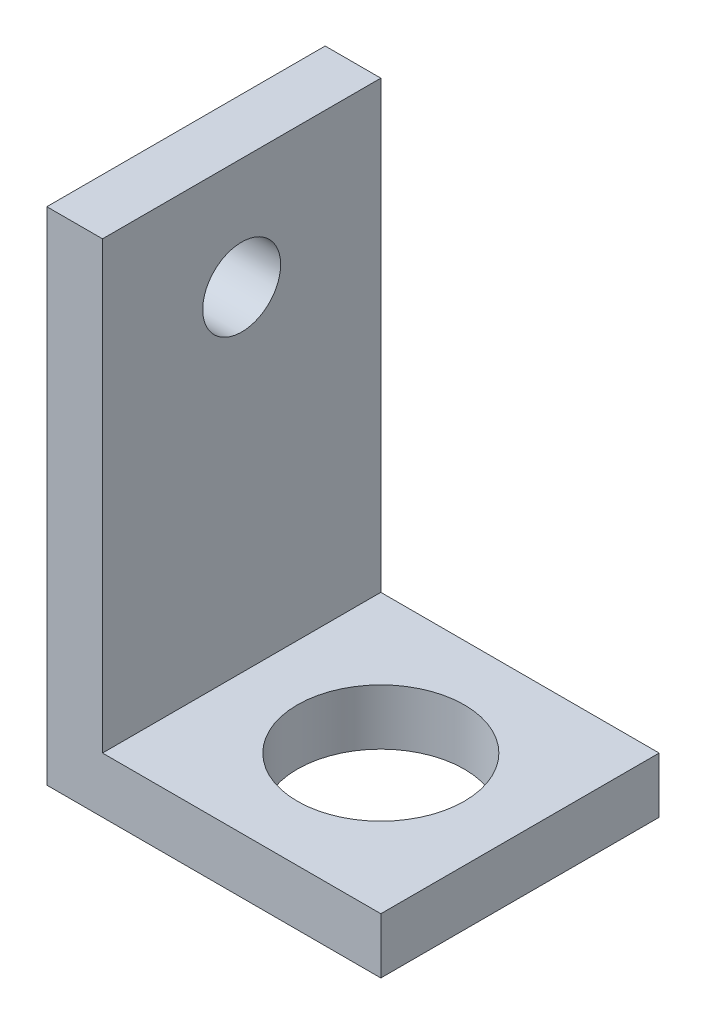
ISO-10303-21;
HEADER;
FILE_DESCRIPTION(('STEP AP214'),'2;1');
FILE_NAME('part.step','',(''),(''),'','','');
FILE_SCHEMA(('AUTOMOTIVE_DESIGN { 1 0 10303 214 1 1 1 1 }'));
ENDSEC;
DATA;
#1=APPLICATION_CONTEXT('core data for automotive mechanical design processes');
#2=APPLICATION_PROTOCOL_DEFINITION('international standard','automotive_design',2000,#1);
#3=PRODUCT_CONTEXT('',#1,'mechanical');
#4=PRODUCT('Part','Part','',(#3));
#5=PRODUCT_RELATED_PRODUCT_CATEGORY('part','',(#4));
#6=PRODUCT_DEFINITION_FORMATION('','',#4);
#7=PRODUCT_DEFINITION_CONTEXT('part definition',#1,'design');
#8=PRODUCT_DEFINITION('design','',#6,#7);
#9=PRODUCT_DEFINITION_SHAPE('','',#8);
#10=(LENGTH_UNIT() NAMED_UNIT(*) SI_UNIT(.MILLI.,.METRE.));
#11=(NAMED_UNIT(*) PLANE_ANGLE_UNIT() SI_UNIT($,.RADIAN.));
#12=(NAMED_UNIT(*) SI_UNIT($,.STERADIAN.) SOLID_ANGLE_UNIT());
#13=UNCERTAINTY_MEASURE_WITH_UNIT(LENGTH_MEASURE(1.E-05),#10,'distance_accuracy_value','');
#14=(GEOMETRIC_REPRESENTATION_CONTEXT(3) GLOBAL_UNCERTAINTY_ASSIGNED_CONTEXT((#13)) GLOBAL_UNIT_ASSIGNED_CONTEXT((#10,
#11,#12)) REPRESENTATION_CONTEXT('',''));
#15=CARTESIAN_POINT('',(0.,0.,0.));
#16=DIRECTION('',(0.,0.,1.));
#17=DIRECTION('',(1.,0.,0.));
#18=AXIS2_PLACEMENT_3D('',#15,#16,#17);
#19=CARTESIAN_POINT('',(0.,-10.,50.));
#20=DIRECTION('',(0.,1.,0.));
#21=DIRECTION('',(0.,0.,1.));
#22=AXIS2_PLACEMENT_3D('',#19,#20,#21);
#23=PLANE('',#22);
#24=CARTESIAN_POINT('',(25.,-10.,25.));
#25=DIRECTION('',(0.,1.,0.));
#26=DIRECTION('',(0.,0.,1.));
#27=AXIS2_PLACEMENT_3D('',#24,#25,#26);
#28=CIRCLE('',#27,15.);
#29=CARTESIAN_POINT('',(25.,-10.,40.));
#30=VERTEX_POINT('',#29);
#31=EDGE_CURVE('E118',#30,#30,#28,.T.);
#32=ORIENTED_EDGE('',*,*,#31,.T.);
#33=EDGE_LOOP('',(#32));
#34=FACE_BOUND('',#33,.T.);
#35=DIRECTION('',(1.,0.,0.));
#36=VECTOR('',#35,1.);
#37=CARTESIAN_POINT('',(0.,-10.,0.));
#38=LINE('',#37,#36);
#39=CARTESIAN_POINT('',(-10.,-10.,0.));
#40=VERTEX_POINT('',#39);
#41=CARTESIAN_POINT('',(50.,-10.,0.));
#42=VERTEX_POINT('',#41);
#43=EDGE_CURVE('E114',#40,#42,#38,.T.);
#44=ORIENTED_EDGE('',*,*,#43,.T.);
#45=DIRECTION('',(0.,0.,-1.));
#46=VECTOR('',#45,1.);
#47=CARTESIAN_POINT('',(50.,-10.,50.));
#48=LINE('',#47,#46);
#49=CARTESIAN_POINT('',(50.,-10.,50.));
#50=VERTEX_POINT('',#49);
#51=EDGE_CURVE('E11',#50,#42,#48,.T.);
#52=ORIENTED_EDGE('',*,*,#51,.F.);
#53=DIRECTION('',(1.,0.,0.));
#54=VECTOR('',#53,1.);
#55=CARTESIAN_POINT('',(0.,-10.,50.));
#56=LINE('',#55,#54);
#57=CARTESIAN_POINT('',(-10.,-10.,50.));
#58=VERTEX_POINT('',#57);
#59=EDGE_CURVE('E79',#58,#50,#56,.T.);
#60=ORIENTED_EDGE('',*,*,#59,.F.);
#61=DIRECTION('',(0.,0.,-1.));
#62=VECTOR('',#61,1.);
#63=CARTESIAN_POINT('',(-10.,-10.,50.));
#64=LINE('',#63,#62);
#65=EDGE_CURVE('E110',#58,#40,#64,.T.);
#66=ORIENTED_EDGE('',*,*,#65,.T.);
#67=EDGE_LOOP('',(#44,#52,#60,#66));
#68=FACE_BOUND('',#67,.T.);
#69=ADVANCED_FACE('F33',(#34,#68),#23,.F.);
#70=CARTESIAN_POINT('',(50.,0.,50.));
#71=DIRECTION('',(1.,0.,0.));
#72=DIRECTION('',(0.,0.,-1.));
#73=AXIS2_PLACEMENT_3D('',#70,#71,#72);
#74=PLANE('',#73);
#75=DIRECTION('',(0.,-1.,0.));
#76=VECTOR('',#75,1.);
#77=CARTESIAN_POINT('',(50.,0.,0.));
#78=LINE('',#77,#76);
#79=CARTESIAN_POINT('',(50.,0.,0.));
#80=VERTEX_POINT('',#79);
#81=EDGE_CURVE('E117',#80,#42,#78,.T.);
#82=ORIENTED_EDGE('',*,*,#81,.F.);
#83=DIRECTION('',(0.,0.,-1.));
#84=VECTOR('',#83,1.);
#85=CARTESIAN_POINT('',(50.,0.,50.));
#86=LINE('',#85,#84);
#87=CARTESIAN_POINT('',(50.,0.,50.));
#88=VERTEX_POINT('',#87);
#89=EDGE_CURVE('E41',#88,#80,#86,.T.);
#90=ORIENTED_EDGE('',*,*,#89,.F.);
#91=DIRECTION('',(0.,-1.,0.));
#92=VECTOR('',#91,1.);
#93=CARTESIAN_POINT('',(50.,0.,50.));
#94=LINE('',#93,#92);
#95=EDGE_CURVE('E171',#88,#50,#94,.T.);
#96=ORIENTED_EDGE('',*,*,#95,.T.);
#97=ORIENTED_EDGE('',*,*,#51,.T.);
#98=EDGE_LOOP('',(#82,#90,#96,#97));
#99=FACE_BOUND('',#98,.T.);
#100=ADVANCED_FACE('F136',(#99),#74,.T.);
#101=CARTESIAN_POINT('',(0.,0.,50.));
#102=DIRECTION('',(0.,1.,0.));
#103=DIRECTION('',(0.,0.,1.));
#104=AXIS2_PLACEMENT_3D('',#101,#102,#103);
#105=PLANE('',#104);
#106=CARTESIAN_POINT('',(25.,0.,25.));
#107=DIRECTION('',(0.,1.,0.));
#108=DIRECTION('',(0.,0.,1.));
#109=AXIS2_PLACEMENT_3D('',#106,#107,#108);
#110=CIRCLE('',#109,15.);
#111=CARTESIAN_POINT('',(25.,0.,40.));
#112=VERTEX_POINT('',#111);
#113=EDGE_CURVE('E161',#112,#112,#110,.T.);
#114=ORIENTED_EDGE('',*,*,#113,.F.);
#115=EDGE_LOOP('',(#114));
#116=FACE_BOUND('',#115,.T.);
#117=DIRECTION('',(1.,0.,0.));
#118=VECTOR('',#117,1.);
#119=CARTESIAN_POINT('',(0.,0.,0.));
#120=LINE('',#119,#118);
#121=CARTESIAN_POINT('',(0.,0.,0.));
#122=VERTEX_POINT('',#121);
#123=EDGE_CURVE('E121',#122,#80,#120,.T.);
#124=ORIENTED_EDGE('',*,*,#123,.F.);
#125=DIRECTION('',(0.,0.,-1.));
#126=VECTOR('',#125,1.);
#127=CARTESIAN_POINT('',(0.,0.,50.));
#128=LINE('',#127,#126);
#129=CARTESIAN_POINT('',(0.,0.,50.));
#130=VERTEX_POINT('',#129);
#131=EDGE_CURVE('E100',#130,#122,#128,.T.);
#132=ORIENTED_EDGE('',*,*,#131,.F.);
#133=DIRECTION('',(1.,0.,0.));
#134=VECTOR('',#133,1.);
#135=CARTESIAN_POINT('',(0.,0.,50.));
#136=LINE('',#135,#134);
#137=EDGE_CURVE('E106',#130,#88,#136,.T.);
#138=ORIENTED_EDGE('',*,*,#137,.T.);
#139=ORIENTED_EDGE('',*,*,#89,.T.);
#140=EDGE_LOOP('',(#124,#132,#138,#139));
#141=FACE_BOUND('',#140,.T.);
#142=ADVANCED_FACE('F133',(#116,#141),#105,.T.);
#143=CARTESIAN_POINT('',(0.,80.,50.));
#144=DIRECTION('',(1.,0.,0.));
#145=DIRECTION('',(0.,0.,-1.));
#146=AXIS2_PLACEMENT_3D('',#143,#144,#145);
#147=PLANE('',#146);
#148=CARTESIAN_POINT('',(0.,60.,25.));
#149=DIRECTION('',(1.,0.,0.));
#150=DIRECTION('',(0.,0.,-1.));
#151=AXIS2_PLACEMENT_3D('',#148,#149,#150);
#152=CIRCLE('',#151,7.);
#153=CARTESIAN_POINT('',(0.,60.,18.));
#154=VERTEX_POINT('',#153);
#155=EDGE_CURVE('E167',#154,#154,#152,.T.);
#156=ORIENTED_EDGE('',*,*,#155,.F.);
#157=EDGE_LOOP('',(#156));
#158=FACE_BOUND('',#157,.T.);
#159=DIRECTION('',(0.,-1.,0.));
#160=VECTOR('',#159,1.);
#161=CARTESIAN_POINT('',(0.,80.,0.));
#162=LINE('',#161,#160);
#163=CARTESIAN_POINT('',(0.,80.,0.));
#164=VERTEX_POINT('',#163);
#165=EDGE_CURVE('E95',#164,#122,#162,.T.);
#166=ORIENTED_EDGE('',*,*,#165,.F.);
#167=DIRECTION('',(0.,0.,-1.));
#168=VECTOR('',#167,1.);
#169=CARTESIAN_POINT('',(0.,80.,50.));
#170=LINE('',#169,#168);
#171=CARTESIAN_POINT('',(0.,80.,50.));
#172=VERTEX_POINT('',#171);
#173=EDGE_CURVE('E90',#172,#164,#170,.T.);
#174=ORIENTED_EDGE('',*,*,#173,.F.);
#175=DIRECTION('',(0.,-1.,0.));
#176=VECTOR('',#175,1.);
#177=CARTESIAN_POINT('',(0.,80.,50.));
#178=LINE('',#177,#176);
#179=EDGE_CURVE('E93',#172,#130,#178,.T.);
#180=ORIENTED_EDGE('',*,*,#179,.T.);
#181=ORIENTED_EDGE('',*,*,#131,.T.);
#182=EDGE_LOOP('',(#166,#174,#180,#181));
#183=FACE_BOUND('',#182,.T.);
#184=ADVANCED_FACE('F92',(#158,#183),#147,.T.);
#185=CARTESIAN_POINT('',(-10.,80.,50.));
#186=DIRECTION('',(0.,1.,0.));
#187=DIRECTION('',(0.,0.,1.));
#188=AXIS2_PLACEMENT_3D('',#185,#186,#187);
#189=PLANE('',#188);
#190=DIRECTION('',(1.,0.,0.));
#191=VECTOR('',#190,1.);
#192=CARTESIAN_POINT('',(-10.,80.,0.));
#193=LINE('',#192,#191);
#194=CARTESIAN_POINT('',(-10.,80.,0.));
#195=VERTEX_POINT('',#194);
#196=EDGE_CURVE('E125',#195,#164,#193,.T.);
#197=ORIENTED_EDGE('',*,*,#196,.F.);
#198=DIRECTION('',(0.,0.,-1.));
#199=VECTOR('',#198,1.);
#200=CARTESIAN_POINT('',(-10.,80.,50.));
#201=LINE('',#200,#199);
#202=CARTESIAN_POINT('',(-10.,80.,50.));
#203=VERTEX_POINT('',#202);
#204=EDGE_CURVE('E70',#203,#195,#201,.T.);
#205=ORIENTED_EDGE('',*,*,#204,.F.);
#206=DIRECTION('',(1.,0.,0.));
#207=VECTOR('',#206,1.);
#208=CARTESIAN_POINT('',(-10.,80.,50.));
#209=LINE('',#208,#207);
#210=EDGE_CURVE('E104',#203,#172,#209,.T.);
#211=ORIENTED_EDGE('',*,*,#210,.T.);
#212=ORIENTED_EDGE('',*,*,#173,.T.);
#213=EDGE_LOOP('',(#197,#205,#211,#212));
#214=FACE_BOUND('',#213,.T.);
#215=ADVANCED_FACE('F108',(#214),#189,.T.);
#216=CARTESIAN_POINT('',(-10.,80.,50.));
#217=DIRECTION('',(1.,0.,0.));
#218=DIRECTION('',(0.,0.,-1.));
#219=AXIS2_PLACEMENT_3D('',#216,#217,#218);
#220=PLANE('',#219);
#221=CARTESIAN_POINT('',(-10.,60.,25.));
#222=DIRECTION('',(1.,0.,0.));
#223=DIRECTION('',(0.,0.,-1.));
#224=AXIS2_PLACEMENT_3D('',#221,#222,#223);
#225=CIRCLE('',#224,7.);
#226=CARTESIAN_POINT('',(-10.,60.,18.));
#227=VERTEX_POINT('',#226);
#228=EDGE_CURVE('E164',#227,#227,#225,.T.);
#229=ORIENTED_EDGE('',*,*,#228,.T.);
#230=EDGE_LOOP('',(#229));
#231=FACE_BOUND('',#230,.T.);
#232=DIRECTION('',(0.,1.,0.));
#233=VECTOR('',#232,1.);
#234=CARTESIAN_POINT('',(-10.,80.,0.));
#235=LINE('',#234,#233);
#236=EDGE_CURVE('E73',#195,#40,#235,.F.);
#237=ORIENTED_EDGE('',*,*,#236,.T.);
#238=ORIENTED_EDGE('',*,*,#65,.F.);
#239=DIRECTION('',(0.,1.,0.));
#240=VECTOR('',#239,1.);
#241=CARTESIAN_POINT('',(-10.,80.,50.));
#242=LINE('',#241,#240);
#243=EDGE_CURVE('E49',#203,#58,#242,.F.);
#244=ORIENTED_EDGE('',*,*,#243,.F.);
#245=ORIENTED_EDGE('',*,*,#204,.T.);
#246=EDGE_LOOP('',(#237,#238,#244,#245));
#247=FACE_BOUND('',#246,.T.);
#248=ADVANCED_FACE('F141',(#231,#247),#220,.F.);
#249=CARTESIAN_POINT('',(0.,0.,50.));
#250=DIRECTION('',(0.,0.,-1.));
#251=DIRECTION('',(-1.,0.,0.));
#252=AXIS2_PLACEMENT_3D('',#249,#250,#251);
#253=PLANE('',#252);
#254=ORIENTED_EDGE('',*,*,#59,.T.);
#255=ORIENTED_EDGE('',*,*,#95,.F.);
#256=ORIENTED_EDGE('',*,*,#137,.F.);
#257=ORIENTED_EDGE('',*,*,#179,.F.);
#258=ORIENTED_EDGE('',*,*,#210,.F.);
#259=ORIENTED_EDGE('',*,*,#243,.T.);
#260=EDGE_LOOP('',(#254,#255,#256,#257,#258,#259));
#261=FACE_BOUND('',#260,.T.);
#262=ADVANCED_FACE('F103',(#261),#253,.F.);
#263=CARTESIAN_POINT('',(0.,0.,0.));
#264=DIRECTION('',(0.,0.,-1.));
#265=DIRECTION('',(-1.,0.,0.));
#266=AXIS2_PLACEMENT_3D('',#263,#264,#265);
#267=PLANE('',#266);
#268=ORIENTED_EDGE('',*,*,#43,.F.);
#269=ORIENTED_EDGE('',*,*,#236,.F.);
#270=ORIENTED_EDGE('',*,*,#196,.T.);
#271=ORIENTED_EDGE('',*,*,#165,.T.);
#272=ORIENTED_EDGE('',*,*,#123,.T.);
#273=ORIENTED_EDGE('',*,*,#81,.T.);
#274=EDGE_LOOP('',(#268,#269,#270,#271,#272,#273));
#275=FACE_BOUND('',#274,.T.);
#276=ADVANCED_FACE('F139',(#275),#267,.T.);
#277=CARTESIAN_POINT('',(25.,-10.,25.));
#278=DIRECTION('',(0.,1.,0.));
#279=DIRECTION('',(0.,0.,1.));
#280=AXIS2_PLACEMENT_3D('',#277,#278,#279);
#281=CYLINDRICAL_SURFACE('',#280,15.);
#282=ORIENTED_EDGE('',*,*,#31,.F.);
#283=EDGE_LOOP('',(#282));
#284=FACE_BOUND('',#283,.T.);
#285=ORIENTED_EDGE('',*,*,#113,.T.);
#286=EDGE_LOOP('',(#285));
#287=FACE_BOUND('',#286,.T.);
#288=ADVANCED_FACE('F178',(#284,#287),#281,.F.);
#289=CARTESIAN_POINT('',(-10.,60.,25.));
#290=DIRECTION('',(1.,0.,0.));
#291=DIRECTION('',(0.,0.,-1.));
#292=AXIS2_PLACEMENT_3D('',#289,#290,#291);
#293=CYLINDRICAL_SURFACE('',#292,7.);
#294=ORIENTED_EDGE('',*,*,#228,.F.);
#295=EDGE_LOOP('',(#294));
#296=FACE_BOUND('',#295,.T.);
#297=ORIENTED_EDGE('',*,*,#155,.T.);
#298=EDGE_LOOP('',(#297));
#299=FACE_BOUND('',#298,.T.);
#300=ADVANCED_FACE('F175',(#296,#299),#293,.F.);
#301=CLOSED_SHELL('',(#69,#100,#142,#184,#215,#248,#262,#276,#288,#300));
#302=MANIFOLD_SOLID_BREP('B2',#301);
#303=ADVANCED_BREP_SHAPE_REPRESENTATION('',(#18,#302),#14);
#304=SHAPE_DEFINITION_REPRESENTATION(#9,#303);
ENDSEC;
END-ISO-10303-21;
